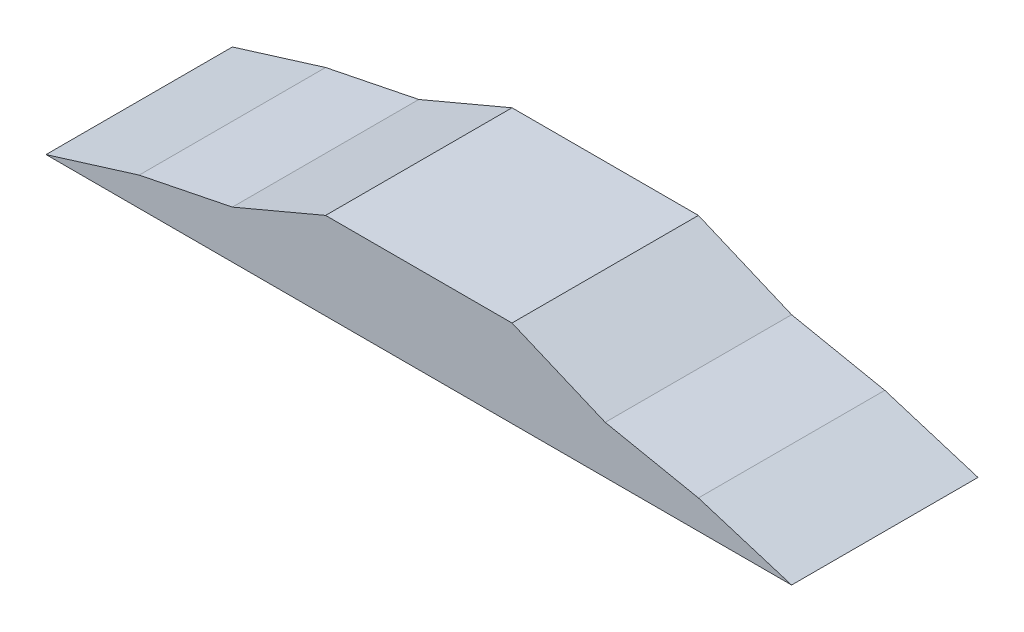
ISO-10303-21;
HEADER;
FILE_DESCRIPTION(('STEP AP214'),'2;1');
FILE_NAME('part.step','',(''),(''),'','','');
FILE_SCHEMA(('AUTOMOTIVE_DESIGN { 1 0 10303 214 1 1 1 1 }'));
ENDSEC;
DATA;
#1=APPLICATION_CONTEXT('core data for automotive mechanical design processes');
#2=APPLICATION_PROTOCOL_DEFINITION('international standard','automotive_design',2000,#1);
#3=PRODUCT_CONTEXT('',#1,'mechanical');
#4=PRODUCT('Part','Part','',(#3));
#5=PRODUCT_RELATED_PRODUCT_CATEGORY('part','',(#4));
#6=PRODUCT_DEFINITION_FORMATION('','',#4);
#7=PRODUCT_DEFINITION_CONTEXT('part definition',#1,'design');
#8=PRODUCT_DEFINITION('design','',#6,#7);
#9=PRODUCT_DEFINITION_SHAPE('','',#8);
#10=(LENGTH_UNIT() NAMED_UNIT(*) SI_UNIT(.MILLI.,.METRE.));
#11=(NAMED_UNIT(*) PLANE_ANGLE_UNIT() SI_UNIT($,.RADIAN.));
#12=(NAMED_UNIT(*) SI_UNIT($,.STERADIAN.) SOLID_ANGLE_UNIT());
#13=UNCERTAINTY_MEASURE_WITH_UNIT(LENGTH_MEASURE(1.E-05),#10,'distance_accuracy_value','');
#14=(GEOMETRIC_REPRESENTATION_CONTEXT(3) GLOBAL_UNCERTAINTY_ASSIGNED_CONTEXT((#13)) GLOBAL_UNIT_ASSIGNED_CONTEXT((#10,
#11,#12)) REPRESENTATION_CONTEXT('',''));
#15=CARTESIAN_POINT('',(0.,0.,0.));
#16=DIRECTION('',(0.,0.,1.));
#17=DIRECTION('',(1.,0.,0.));
#18=AXIS2_PLACEMENT_3D('',#15,#16,#17);
#19=CARTESIAN_POINT('',(-100.,25.6023142559145,100.));
#20=DIRECTION('',(0.389418342308644,-0.921060994002888,0.));
#21=DIRECTION('',(0.921060994002888,0.389418342308644,0.));
#22=AXIS2_PLACEMENT_3D('',#19,#20,#21);
#23=PLANE('',#22);
#24=DIRECTION('',(-0.921060994002888,-0.389418342308644,0.));
#25=VECTOR('',#24,1.);
#26=CARTESIAN_POINT('',(-100.,25.6023142559145,0.));
#27=LINE('',#26,#25);
#28=CARTESIAN_POINT('',(-50.,46.7419751928222,0.));
#29=VERTEX_POINT('',#28);
#30=CARTESIAN_POINT('',(-100.,25.6023142559145,0.));
#31=VERTEX_POINT('',#30);
#32=EDGE_CURVE('E140',#29,#31,#27,.T.);
#33=ORIENTED_EDGE('',*,*,#32,.T.);
#34=DIRECTION('',(0.,0.,-1.));
#35=VECTOR('',#34,1.);
#36=CARTESIAN_POINT('',(-100.,25.6023142559145,100.));
#37=LINE('',#36,#35);
#38=CARTESIAN_POINT('',(-100.,25.6023142559145,100.));
#39=VERTEX_POINT('',#38);
#40=EDGE_CURVE('E11',#39,#31,#37,.T.);
#41=ORIENTED_EDGE('',*,*,#40,.F.);
#42=DIRECTION('',(-0.921060994002888,-0.389418342308644,0.));
#43=VECTOR('',#42,1.);
#44=CARTESIAN_POINT('',(-100.,25.6023142559145,100.));
#45=LINE('',#44,#43);
#46=CARTESIAN_POINT('',(-50.,46.7419751928222,100.));
#47=VERTEX_POINT('',#46);
#48=EDGE_CURVE('E162',#47,#39,#45,.T.);
#49=ORIENTED_EDGE('',*,*,#48,.F.);
#50=DIRECTION('',(0.,0.,-1.));
#51=VECTOR('',#50,1.);
#52=CARTESIAN_POINT('',(-50.,46.7419751928222,100.));
#53=LINE('',#52,#51);
#54=EDGE_CURVE('E136',#47,#29,#53,.T.);
#55=ORIENTED_EDGE('',*,*,#54,.T.);
#56=EDGE_LOOP('',(#33,#41,#49,#55));
#57=FACE_BOUND('',#56,.T.);
#58=ADVANCED_FACE('F39',(#57),#23,.F.);
#59=CARTESIAN_POINT('',(-150.,15.4668124804811,100.));
#60=DIRECTION('',(0.198669330795057,-0.980066577841243,0.));
#61=DIRECTION('',(0.980066577841243,0.198669330795057,0.));
#62=AXIS2_PLACEMENT_3D('',#59,#60,#61);
#63=PLANE('',#62);
#64=DIRECTION('',(-0.980066577841243,-0.198669330795057,0.));
#65=VECTOR('',#64,1.);
#66=CARTESIAN_POINT('',(-150.,15.4668124804811,0.));
#67=LINE('',#66,#65);
#68=CARTESIAN_POINT('',(-150.,15.4668124804811,0.));
#69=VERTEX_POINT('',#68);
#70=EDGE_CURVE('E144',#31,#69,#67,.T.);
#71=ORIENTED_EDGE('',*,*,#70,.T.);
#72=DIRECTION('',(0.,0.,-1.));
#73=VECTOR('',#72,1.);
#74=CARTESIAN_POINT('',(-150.,15.4668124804811,100.));
#75=LINE('',#74,#73);
#76=CARTESIAN_POINT('',(-150.,15.4668124804811,100.));
#77=VERTEX_POINT('',#76);
#78=EDGE_CURVE('E48',#77,#69,#75,.T.);
#79=ORIENTED_EDGE('',*,*,#78,.F.);
#80=DIRECTION('',(-0.980066577841243,-0.198669330795057,0.));
#81=VECTOR('',#80,1.);
#82=CARTESIAN_POINT('',(-150.,15.4668124804811,100.));
#83=LINE('',#82,#81);
#84=EDGE_CURVE('E99',#39,#77,#83,.T.);
#85=ORIENTED_EDGE('',*,*,#84,.F.);
#86=ORIENTED_EDGE('',*,*,#40,.T.);
#87=EDGE_LOOP('',(#71,#79,#85,#86));
#88=FACE_BOUND('',#87,.T.);
#89=ADVANCED_FACE('F208',(#88),#63,.F.);
#90=CARTESIAN_POINT('',(-150.,15.4668124804811,100.));
#91=DIRECTION('',(0.29552020666134,-0.955336489125606,0.));
#92=DIRECTION('',(0.955336489125606,0.29552020666134,0.));
#93=AXIS2_PLACEMENT_3D('',#90,#91,#92);
#94=PLANE('',#93);
#95=DIRECTION('',(-0.955336489125606,-0.29552020666134,0.));
#96=VECTOR('',#95,1.);
#97=CARTESIAN_POINT('',(-150.,15.4668124804811,0.));
#98=LINE('',#97,#96);
#99=CARTESIAN_POINT('',(-200.,0.,0.));
#100=VERTEX_POINT('',#99);
#101=EDGE_CURVE('E147',#69,#100,#98,.T.);
#102=ORIENTED_EDGE('',*,*,#101,.T.);
#103=DIRECTION('',(0.,0.,-1.));
#104=VECTOR('',#103,1.);
#105=CARTESIAN_POINT('',(-200.,0.,100.));
#106=LINE('',#105,#104);
#107=CARTESIAN_POINT('',(-200.,0.,100.));
#108=VERTEX_POINT('',#107);
#109=EDGE_CURVE('E173',#108,#100,#106,.T.);
#110=ORIENTED_EDGE('',*,*,#109,.F.);
#111=DIRECTION('',(-0.955336489125606,-0.29552020666134,0.));
#112=VECTOR('',#111,1.);
#113=CARTESIAN_POINT('',(-150.,15.4668124804811,100.));
#114=LINE('',#113,#112);
#115=EDGE_CURVE('E183',#77,#108,#114,.T.);
#116=ORIENTED_EDGE('',*,*,#115,.F.);
#117=ORIENTED_EDGE('',*,*,#78,.T.);
#118=EDGE_LOOP('',(#102,#110,#116,#117));
#119=FACE_BOUND('',#118,.T.);
#120=ADVANCED_FACE('F181',(#119),#94,.F.);
#121=CARTESIAN_POINT('',(-200.,0.,100.));
#122=DIRECTION('',(0.,1.,0.));
#123=DIRECTION('',(-1.,0.,0.));
#124=AXIS2_PLACEMENT_3D('',#121,#122,#123);
#125=PLANE('',#124);
#126=DIRECTION('',(1.,0.,0.));
#127=VECTOR('',#126,1.);
#128=CARTESIAN_POINT('',(-200.,0.,0.));
#129=LINE('',#128,#127);
#130=CARTESIAN_POINT('',(200.,0.,0.));
#131=VERTEX_POINT('',#130);
#132=EDGE_CURVE('E150',#100,#131,#129,.T.);
#133=ORIENTED_EDGE('',*,*,#132,.T.);
#134=DIRECTION('',(0.,0.,-1.));
#135=VECTOR('',#134,1.);
#136=CARTESIAN_POINT('',(200.,0.,100.));
#137=LINE('',#136,#135);
#138=CARTESIAN_POINT('',(200.,0.,100.));
#139=VERTEX_POINT('',#138);
#140=EDGE_CURVE('E169',#139,#131,#137,.T.);
#141=ORIENTED_EDGE('',*,*,#140,.F.);
#142=DIRECTION('',(1.,0.,0.));
#143=VECTOR('',#142,1.);
#144=CARTESIAN_POINT('',(-200.,0.,100.));
#145=LINE('',#144,#143);
#146=EDGE_CURVE('E196',#108,#139,#145,.T.);
#147=ORIENTED_EDGE('',*,*,#146,.F.);
#148=ORIENTED_EDGE('',*,*,#109,.T.);
#149=EDGE_LOOP('',(#133,#141,#147,#148));
#150=FACE_BOUND('',#149,.T.);
#151=ADVANCED_FACE('F191',(#150),#125,.F.);
#152=CARTESIAN_POINT('',(150.,15.4668124804811,100.));
#153=DIRECTION('',(-0.295520206661338,-0.955336489125607,0.));
#154=DIRECTION('',(0.955336489125607,-0.295520206661338,0.));
#155=AXIS2_PLACEMENT_3D('',#152,#153,#154);
#156=PLANE('',#155);
#157=DIRECTION('',(-0.955336489125606,0.295520206661338,0.));
#158=VECTOR('',#157,1.);
#159=CARTESIAN_POINT('',(150.,15.4668124804811,0.));
#160=LINE('',#159,#158);
#161=CARTESIAN_POINT('',(150.,15.4668124804811,0.));
#162=VERTEX_POINT('',#161);
#163=EDGE_CURVE('E153',#131,#162,#160,.T.);
#164=ORIENTED_EDGE('',*,*,#163,.T.);
#165=DIRECTION('',(0.,0.,-1.));
#166=VECTOR('',#165,1.);
#167=CARTESIAN_POINT('',(150.,15.4668124804811,100.));
#168=LINE('',#167,#166);
#169=CARTESIAN_POINT('',(150.,15.4668124804811,100.));
#170=VERTEX_POINT('',#169);
#171=EDGE_CURVE('E129',#170,#162,#168,.T.);
#172=ORIENTED_EDGE('',*,*,#171,.F.);
#173=DIRECTION('',(-0.955336489125606,0.295520206661338,0.));
#174=VECTOR('',#173,1.);
#175=CARTESIAN_POINT('',(150.,15.4668124804811,100.));
#176=LINE('',#175,#174);
#177=EDGE_CURVE('E118',#139,#170,#176,.T.);
#178=ORIENTED_EDGE('',*,*,#177,.F.);
#179=ORIENTED_EDGE('',*,*,#140,.T.);
#180=EDGE_LOOP('',(#164,#172,#178,#179));
#181=FACE_BOUND('',#180,.T.);
#182=ADVANCED_FACE('F194',(#181),#156,.F.);
#183=CARTESIAN_POINT('',(150.,15.4668124804811,100.));
#184=DIRECTION('',(-0.198669330795057,-0.980066577841243,0.));
#185=DIRECTION('',(0.980066577841243,-0.198669330795057,0.));
#186=AXIS2_PLACEMENT_3D('',#183,#184,#185);
#187=PLANE('',#186);
#188=DIRECTION('',(-0.980066577841243,0.198669330795057,0.));
#189=VECTOR('',#188,1.);
#190=CARTESIAN_POINT('',(150.,15.4668124804811,0.));
#191=LINE('',#190,#189);
#192=CARTESIAN_POINT('',(100.,25.6023142559145,0.));
#193=VERTEX_POINT('',#192);
#194=EDGE_CURVE('E127',#162,#193,#191,.T.);
#195=ORIENTED_EDGE('',*,*,#194,.T.);
#196=DIRECTION('',(0.,0.,-1.));
#197=VECTOR('',#196,1.);
#198=CARTESIAN_POINT('',(100.,25.6023142559145,100.));
#199=LINE('',#198,#197);
#200=CARTESIAN_POINT('',(100.,25.6023142559145,100.));
#201=VERTEX_POINT('',#200);
#202=EDGE_CURVE('E124',#201,#193,#199,.T.);
#203=ORIENTED_EDGE('',*,*,#202,.F.);
#204=DIRECTION('',(-0.980066577841243,0.198669330795057,0.));
#205=VECTOR('',#204,1.);
#206=CARTESIAN_POINT('',(150.,15.4668124804811,100.));
#207=LINE('',#206,#205);
#208=EDGE_CURVE('E112',#170,#201,#207,.T.);
#209=ORIENTED_EDGE('',*,*,#208,.F.);
#210=ORIENTED_EDGE('',*,*,#171,.T.);
#211=EDGE_LOOP('',(#195,#203,#209,#210));
#212=FACE_BOUND('',#211,.T.);
#213=ADVANCED_FACE('F125',(#212),#187,.F.);
#214=CARTESIAN_POINT('',(100.,25.6023142559145,100.));
#215=DIRECTION('',(-0.389418342308644,-0.921060994002888,0.));
#216=DIRECTION('',(0.921060994002888,-0.389418342308644,0.));
#217=AXIS2_PLACEMENT_3D('',#214,#215,#216);
#218=PLANE('',#217);
#219=DIRECTION('',(-0.921060994002888,0.389418342308644,0.));
#220=VECTOR('',#219,1.);
#221=CARTESIAN_POINT('',(100.,25.6023142559145,0.));
#222=LINE('',#221,#220);
#223=CARTESIAN_POINT('',(50.,46.7419751928222,0.));
#224=VERTEX_POINT('',#223);
#225=EDGE_CURVE('E85',#193,#224,#222,.T.);
#226=ORIENTED_EDGE('',*,*,#225,.T.);
#227=DIRECTION('',(0.,0.,-1.));
#228=VECTOR('',#227,1.);
#229=CARTESIAN_POINT('',(50.,46.7419751928222,100.));
#230=LINE('',#229,#228);
#231=CARTESIAN_POINT('',(50.,46.7419751928222,100.));
#232=VERTEX_POINT('',#231);
#233=EDGE_CURVE('E130',#232,#224,#230,.T.);
#234=ORIENTED_EDGE('',*,*,#233,.F.);
#235=DIRECTION('',(-0.921060994002888,0.389418342308644,0.));
#236=VECTOR('',#235,1.);
#237=CARTESIAN_POINT('',(100.,25.6023142559145,100.));
#238=LINE('',#237,#236);
#239=EDGE_CURVE('E116',#201,#232,#238,.T.);
#240=ORIENTED_EDGE('',*,*,#239,.F.);
#241=ORIENTED_EDGE('',*,*,#202,.T.);
#242=EDGE_LOOP('',(#226,#234,#240,#241));
#243=FACE_BOUND('',#242,.T.);
#244=ADVANCED_FACE('F132',(#243),#218,.F.);
#245=CARTESIAN_POINT('',(-50.,46.7419751928222,100.));
#246=DIRECTION('',(0.,-1.,0.));
#247=DIRECTION('',(0.,0.,-1.));
#248=AXIS2_PLACEMENT_3D('',#245,#246,#247);
#249=PLANE('',#248);
#250=DIRECTION('',(-1.,0.,0.));
#251=VECTOR('',#250,1.);
#252=CARTESIAN_POINT('',(-50.,46.7419751928222,0.));
#253=LINE('',#252,#251);
#254=EDGE_CURVE('E91',#224,#29,#253,.T.);
#255=ORIENTED_EDGE('',*,*,#254,.T.);
#256=ORIENTED_EDGE('',*,*,#54,.F.);
#257=DIRECTION('',(-1.,0.,0.));
#258=VECTOR('',#257,1.);
#259=CARTESIAN_POINT('',(-50.,46.7419751928222,100.));
#260=LINE('',#259,#258);
#261=EDGE_CURVE('E56',#232,#47,#260,.T.);
#262=ORIENTED_EDGE('',*,*,#261,.F.);
#263=ORIENTED_EDGE('',*,*,#233,.T.);
#264=EDGE_LOOP('',(#255,#256,#262,#263));
#265=FACE_BOUND('',#264,.T.);
#266=ADVANCED_FACE('F224',(#265),#249,.F.);
#267=CARTESIAN_POINT('',(0.,0.,100.));
#268=DIRECTION('',(0.,0.,1.));
#269=DIRECTION('',(1.,0.,0.));
#270=AXIS2_PLACEMENT_3D('',#267,#268,#269);
#271=PLANE('',#270);
#272=ORIENTED_EDGE('',*,*,#48,.T.);
#273=ORIENTED_EDGE('',*,*,#84,.T.);
#274=ORIENTED_EDGE('',*,*,#115,.T.);
#275=ORIENTED_EDGE('',*,*,#146,.T.);
#276=ORIENTED_EDGE('',*,*,#177,.T.);
#277=ORIENTED_EDGE('',*,*,#208,.T.);
#278=ORIENTED_EDGE('',*,*,#239,.T.);
#279=ORIENTED_EDGE('',*,*,#261,.T.);
#280=EDGE_LOOP('',(#272,#273,#274,#275,#276,#277,#278,#279));
#281=FACE_BOUND('',#280,.T.);
#282=ADVANCED_FACE('F114',(#281),#271,.T.);
#283=CARTESIAN_POINT('',(0.,0.,0.));
#284=DIRECTION('',(0.,0.,1.));
#285=DIRECTION('',(1.,0.,0.));
#286=AXIS2_PLACEMENT_3D('',#283,#284,#285);
#287=PLANE('',#286);
#288=ORIENTED_EDGE('',*,*,#32,.F.);
#289=ORIENTED_EDGE('',*,*,#254,.F.);
#290=ORIENTED_EDGE('',*,*,#225,.F.);
#291=ORIENTED_EDGE('',*,*,#194,.F.);
#292=ORIENTED_EDGE('',*,*,#163,.F.);
#293=ORIENTED_EDGE('',*,*,#132,.F.);
#294=ORIENTED_EDGE('',*,*,#101,.F.);
#295=ORIENTED_EDGE('',*,*,#70,.F.);
#296=EDGE_LOOP('',(#288,#289,#290,#291,#292,#293,#294,#295));
#297=FACE_BOUND('',#296,.T.);
#298=ADVANCED_FACE('F187',(#297),#287,.F.);
#299=CLOSED_SHELL('',(#58,#89,#120,#151,#182,#213,#244,#266,#282,#298));
#300=MANIFOLD_SOLID_BREP('B2',#299);
#301=ADVANCED_BREP_SHAPE_REPRESENTATION('',(#18,#300),#14);
#302=SHAPE_DEFINITION_REPRESENTATION(#9,#301);
ENDSEC;
END-ISO-10303-21;
